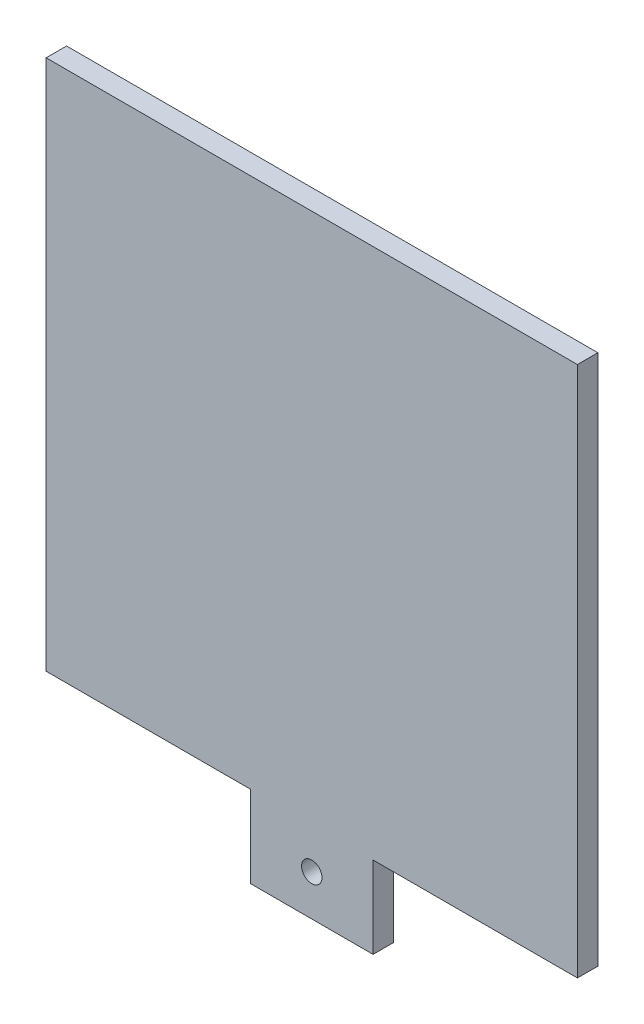
ISO-10303-21;
HEADER;
FILE_DESCRIPTION(('STEP AP214'),'2;1');
FILE_NAME('part.step','',(''),(''),'','','');
FILE_SCHEMA(('AUTOMOTIVE_DESIGN { 1 0 10303 214 1 1 1 1 }'));
ENDSEC;
DATA;
#1=APPLICATION_CONTEXT('core data for automotive mechanical design processes');
#2=APPLICATION_PROTOCOL_DEFINITION('international standard','automotive_design',2000,#1);
#3=PRODUCT_CONTEXT('',#1,'mechanical');
#4=PRODUCT('Part','Part','',(#3));
#5=PRODUCT_RELATED_PRODUCT_CATEGORY('part','',(#4));
#6=PRODUCT_DEFINITION_FORMATION('','',#4);
#7=PRODUCT_DEFINITION_CONTEXT('part definition',#1,'design');
#8=PRODUCT_DEFINITION('design','',#6,#7);
#9=PRODUCT_DEFINITION_SHAPE('','',#8);
#10=(LENGTH_UNIT() NAMED_UNIT(*) SI_UNIT(.MILLI.,.METRE.));
#11=(NAMED_UNIT(*) PLANE_ANGLE_UNIT() SI_UNIT($,.RADIAN.));
#12=(NAMED_UNIT(*) SI_UNIT($,.STERADIAN.) SOLID_ANGLE_UNIT());
#13=UNCERTAINTY_MEASURE_WITH_UNIT(LENGTH_MEASURE(1.E-05),#10,'distance_accuracy_value','');
#14=(GEOMETRIC_REPRESENTATION_CONTEXT(3) GLOBAL_UNCERTAINTY_ASSIGNED_CONTEXT((#13)) GLOBAL_UNIT_ASSIGNED_CONTEXT((#10,
#11,#12)) REPRESENTATION_CONTEXT('',''));
#15=CARTESIAN_POINT('',(0.,0.,0.));
#16=DIRECTION('',(0.,0.,1.));
#17=DIRECTION('',(1.,0.,0.));
#18=AXIS2_PLACEMENT_3D('',#15,#16,#17);
#19=CARTESIAN_POINT('',(15.,-65.,5.));
#20=DIRECTION('',(0.,1.,0.));
#21=DIRECTION('',(0.,0.,1.));
#22=AXIS2_PLACEMENT_3D('',#19,#20,#21);
#23=PLANE('',#22);
#24=DIRECTION('',(1.,0.,0.));
#25=VECTOR('',#24,1.);
#26=CARTESIAN_POINT('',(15.,-65.,0.));
#27=LINE('',#26,#25);
#28=CARTESIAN_POINT('',(15.,-65.,0.));
#29=VERTEX_POINT('',#28);
#30=CARTESIAN_POINT('',(65.,-65.,0.));
#31=VERTEX_POINT('',#30);
#32=EDGE_CURVE('E135',#29,#31,#27,.T.);
#33=ORIENTED_EDGE('',*,*,#32,.T.);
#34=DIRECTION('',(0.,0.,-1.));
#35=VECTOR('',#34,1.);
#36=CARTESIAN_POINT('',(65.,-65.,5.));
#37=LINE('',#36,#35);
#38=CARTESIAN_POINT('',(65.,-65.,5.));
#39=VERTEX_POINT('',#38);
#40=EDGE_CURVE('E11',#39,#31,#37,.T.);
#41=ORIENTED_EDGE('',*,*,#40,.F.);
#42=DIRECTION('',(1.,0.,0.));
#43=VECTOR('',#42,1.);
#44=CARTESIAN_POINT('',(15.,-65.,5.));
#45=LINE('',#44,#43);
#46=CARTESIAN_POINT('',(15.,-65.,5.));
#47=VERTEX_POINT('',#46);
#48=EDGE_CURVE('E150',#47,#39,#45,.T.);
#49=ORIENTED_EDGE('',*,*,#48,.F.);
#50=DIRECTION('',(0.,0.,-1.));
#51=VECTOR('',#50,1.);
#52=CARTESIAN_POINT('',(15.,-65.,5.));
#53=LINE('',#52,#51);
#54=EDGE_CURVE('E131',#47,#29,#53,.T.);
#55=ORIENTED_EDGE('',*,*,#54,.T.);
#56=EDGE_LOOP('',(#33,#41,#49,#55));
#57=FACE_BOUND('',#56,.T.);
#58=ADVANCED_FACE('F39',(#57),#23,.F.);
#59=CARTESIAN_POINT('',(65.,65.,5.));
#60=DIRECTION('',(-1.,0.,0.));
#61=DIRECTION('',(0.,-1.,0.));
#62=AXIS2_PLACEMENT_3D('',#59,#60,#61);
#63=PLANE('',#62);
#64=DIRECTION('',(0.,1.,0.));
#65=VECTOR('',#64,1.);
#66=CARTESIAN_POINT('',(65.,65.,0.));
#67=LINE('',#66,#65);
#68=CARTESIAN_POINT('',(65.,65.,0.));
#69=VERTEX_POINT('',#68);
#70=EDGE_CURVE('E138',#31,#69,#67,.T.);
#71=ORIENTED_EDGE('',*,*,#70,.T.);
#72=DIRECTION('',(0.,0.,-1.));
#73=VECTOR('',#72,1.);
#74=CARTESIAN_POINT('',(65.,65.,5.));
#75=LINE('',#74,#73);
#76=CARTESIAN_POINT('',(65.,65.,5.));
#77=VERTEX_POINT('',#76);
#78=EDGE_CURVE('E47',#77,#69,#75,.T.);
#79=ORIENTED_EDGE('',*,*,#78,.F.);
#80=DIRECTION('',(0.,1.,0.));
#81=VECTOR('',#80,1.);
#82=CARTESIAN_POINT('',(65.,65.,5.));
#83=LINE('',#82,#81);
#84=EDGE_CURVE('E98',#39,#77,#83,.T.);
#85=ORIENTED_EDGE('',*,*,#84,.F.);
#86=ORIENTED_EDGE('',*,*,#40,.T.);
#87=EDGE_LOOP('',(#71,#79,#85,#86));
#88=FACE_BOUND('',#87,.T.);
#89=ADVANCED_FACE('F205',(#88),#63,.F.);
#90=CARTESIAN_POINT('',(-65.,65.,5.));
#91=DIRECTION('',(0.,-1.,0.));
#92=DIRECTION('',(0.,0.,-1.));
#93=AXIS2_PLACEMENT_3D('',#90,#91,#92);
#94=PLANE('',#93);
#95=DIRECTION('',(-1.,0.,0.));
#96=VECTOR('',#95,1.);
#97=CARTESIAN_POINT('',(-65.,65.,0.));
#98=LINE('',#97,#96);
#99=CARTESIAN_POINT('',(-65.,65.,0.));
#100=VERTEX_POINT('',#99);
#101=EDGE_CURVE('E141',#69,#100,#98,.T.);
#102=ORIENTED_EDGE('',*,*,#101,.T.);
#103=DIRECTION('',(0.,0.,-1.));
#104=VECTOR('',#103,1.);
#105=CARTESIAN_POINT('',(-65.,65.,5.));
#106=LINE('',#105,#104);
#107=CARTESIAN_POINT('',(-65.,65.,5.));
#108=VERTEX_POINT('',#107);
#109=EDGE_CURVE('E157',#108,#100,#106,.T.);
#110=ORIENTED_EDGE('',*,*,#109,.F.);
#111=DIRECTION('',(-1.,0.,0.));
#112=VECTOR('',#111,1.);
#113=CARTESIAN_POINT('',(-65.,65.,5.));
#114=LINE('',#113,#112);
#115=EDGE_CURVE('E165',#77,#108,#114,.T.);
#116=ORIENTED_EDGE('',*,*,#115,.F.);
#117=ORIENTED_EDGE('',*,*,#78,.T.);
#118=EDGE_LOOP('',(#102,#110,#116,#117));
#119=FACE_BOUND('',#118,.T.);
#120=ADVANCED_FACE('F163',(#119),#94,.F.);
#121=CARTESIAN_POINT('',(-65.,65.,5.));
#122=DIRECTION('',(1.,0.,0.));
#123=DIRECTION('',(0.,1.,0.));
#124=AXIS2_PLACEMENT_3D('',#121,#122,#123);
#125=PLANE('',#124);
#126=DIRECTION('',(0.,-1.,0.));
#127=VECTOR('',#126,1.);
#128=CARTESIAN_POINT('',(-65.,65.,0.));
#129=LINE('',#128,#127);
#130=CARTESIAN_POINT('',(-65.,-65.,0.));
#131=VERTEX_POINT('',#130);
#132=EDGE_CURVE('E143',#100,#131,#129,.T.);
#133=ORIENTED_EDGE('',*,*,#132,.T.);
#134=DIRECTION('',(0.,0.,-1.));
#135=VECTOR('',#134,1.);
#136=CARTESIAN_POINT('',(-65.,-65.,5.));
#137=LINE('',#136,#135);
#138=CARTESIAN_POINT('',(-65.,-65.,5.));
#139=VERTEX_POINT('',#138);
#140=EDGE_CURVE('E154',#139,#131,#137,.T.);
#141=ORIENTED_EDGE('',*,*,#140,.F.);
#142=DIRECTION('',(0.,-1.,0.));
#143=VECTOR('',#142,1.);
#144=CARTESIAN_POINT('',(-65.,65.,5.));
#145=LINE('',#144,#143);
#146=EDGE_CURVE('E177',#108,#139,#145,.T.);
#147=ORIENTED_EDGE('',*,*,#146,.F.);
#148=ORIENTED_EDGE('',*,*,#109,.T.);
#149=EDGE_LOOP('',(#133,#141,#147,#148));
#150=FACE_BOUND('',#149,.T.);
#151=ADVANCED_FACE('F173',(#150),#125,.F.);
#152=CARTESIAN_POINT('',(-65.,-65.,5.));
#153=DIRECTION('',(0.,1.,0.));
#154=DIRECTION('',(0.,0.,1.));
#155=AXIS2_PLACEMENT_3D('',#152,#153,#154);
#156=PLANE('',#155);
#157=DIRECTION('',(1.,0.,0.));
#158=VECTOR('',#157,1.);
#159=CARTESIAN_POINT('',(-65.,-65.,0.));
#160=LINE('',#159,#158);
#161=CARTESIAN_POINT('',(-15.,-65.,0.));
#162=VERTEX_POINT('',#161);
#163=EDGE_CURVE('E145',#131,#162,#160,.T.);
#164=ORIENTED_EDGE('',*,*,#163,.T.);
#165=DIRECTION('',(0.,0.,-1.));
#166=VECTOR('',#165,1.);
#167=CARTESIAN_POINT('',(-15.,-65.,5.));
#168=LINE('',#167,#166);
#169=CARTESIAN_POINT('',(-15.,-65.,5.));
#170=VERTEX_POINT('',#169);
#171=EDGE_CURVE('E126',#170,#162,#168,.T.);
#172=ORIENTED_EDGE('',*,*,#171,.F.);
#173=DIRECTION('',(1.,0.,0.));
#174=VECTOR('',#173,1.);
#175=CARTESIAN_POINT('',(-65.,-65.,5.));
#176=LINE('',#175,#174);
#177=EDGE_CURVE('E117',#139,#170,#176,.T.);
#178=ORIENTED_EDGE('',*,*,#177,.F.);
#179=ORIENTED_EDGE('',*,*,#140,.T.);
#180=EDGE_LOOP('',(#164,#172,#178,#179));
#181=FACE_BOUND('',#180,.T.);
#182=ADVANCED_FACE('F176',(#181),#156,.F.);
#183=CARTESIAN_POINT('',(-15.,-85.,5.));
#184=DIRECTION('',(1.,0.,0.));
#185=DIRECTION('',(0.,0.,-1.));
#186=AXIS2_PLACEMENT_3D('',#183,#184,#185);
#187=PLANE('',#186);
#188=DIRECTION('',(0.,-1.,0.));
#189=VECTOR('',#188,1.);
#190=CARTESIAN_POINT('',(-15.,-85.,0.));
#191=LINE('',#190,#189);
#192=CARTESIAN_POINT('',(-15.,-85.,0.));
#193=VERTEX_POINT('',#192);
#194=EDGE_CURVE('E125',#162,#193,#191,.T.);
#195=ORIENTED_EDGE('',*,*,#194,.T.);
#196=DIRECTION('',(0.,0.,-1.));
#197=VECTOR('',#196,1.);
#198=CARTESIAN_POINT('',(-15.,-85.,5.));
#199=LINE('',#198,#197);
#200=CARTESIAN_POINT('',(-15.,-85.,5.));
#201=VERTEX_POINT('',#200);
#202=EDGE_CURVE('E122',#201,#193,#199,.T.);
#203=ORIENTED_EDGE('',*,*,#202,.F.);
#204=DIRECTION('',(0.,-1.,0.));
#205=VECTOR('',#204,1.);
#206=CARTESIAN_POINT('',(-15.,-85.,5.));
#207=LINE('',#206,#205);
#208=EDGE_CURVE('E111',#170,#201,#207,.T.);
#209=ORIENTED_EDGE('',*,*,#208,.F.);
#210=ORIENTED_EDGE('',*,*,#171,.T.);
#211=EDGE_LOOP('',(#195,#203,#209,#210));
#212=FACE_BOUND('',#211,.T.);
#213=ADVANCED_FACE('F123',(#212),#187,.F.);
#214=CARTESIAN_POINT('',(-15.,-85.,5.));
#215=DIRECTION('',(0.,1.,0.));
#216=DIRECTION('',(0.,0.,1.));
#217=AXIS2_PLACEMENT_3D('',#214,#215,#216);
#218=PLANE('',#217);
#219=DIRECTION('',(1.,0.,0.));
#220=VECTOR('',#219,1.);
#221=CARTESIAN_POINT('',(-15.,-85.,0.));
#222=LINE('',#221,#220);
#223=CARTESIAN_POINT('',(15.,-85.,0.));
#224=VERTEX_POINT('',#223);
#225=EDGE_CURVE('E84',#193,#224,#222,.T.);
#226=ORIENTED_EDGE('',*,*,#225,.T.);
#227=DIRECTION('',(0.,0.,-1.));
#228=VECTOR('',#227,1.);
#229=CARTESIAN_POINT('',(15.,-85.,5.));
#230=LINE('',#229,#228);
#231=CARTESIAN_POINT('',(15.,-85.,5.));
#232=VERTEX_POINT('',#231);
#233=EDGE_CURVE('E127',#232,#224,#230,.T.);
#234=ORIENTED_EDGE('',*,*,#233,.F.);
#235=DIRECTION('',(1.,0.,0.));
#236=VECTOR('',#235,1.);
#237=CARTESIAN_POINT('',(-15.,-85.,5.));
#238=LINE('',#237,#236);
#239=EDGE_CURVE('E115',#201,#232,#238,.T.);
#240=ORIENTED_EDGE('',*,*,#239,.F.);
#241=ORIENTED_EDGE('',*,*,#202,.T.);
#242=EDGE_LOOP('',(#226,#234,#240,#241));
#243=FACE_BOUND('',#242,.T.);
#244=ADVANCED_FACE('F129',(#243),#218,.F.);
#245=CARTESIAN_POINT('',(15.,-85.,5.));
#246=DIRECTION('',(-1.,0.,0.));
#247=DIRECTION('',(0.,0.,1.));
#248=AXIS2_PLACEMENT_3D('',#245,#246,#247);
#249=PLANE('',#248);
#250=DIRECTION('',(0.,1.,0.));
#251=VECTOR('',#250,1.);
#252=CARTESIAN_POINT('',(15.,-85.,0.));
#253=LINE('',#252,#251);
#254=EDGE_CURVE('E90',#224,#29,#253,.T.);
#255=ORIENTED_EDGE('',*,*,#254,.T.);
#256=ORIENTED_EDGE('',*,*,#54,.F.);
#257=DIRECTION('',(0.,1.,0.));
#258=VECTOR('',#257,1.);
#259=CARTESIAN_POINT('',(15.,-85.,5.));
#260=LINE('',#259,#258);
#261=EDGE_CURVE('E55',#232,#47,#260,.T.);
#262=ORIENTED_EDGE('',*,*,#261,.F.);
#263=ORIENTED_EDGE('',*,*,#233,.T.);
#264=EDGE_LOOP('',(#255,#256,#262,#263));
#265=FACE_BOUND('',#264,.T.);
#266=ADVANCED_FACE('F201',(#265),#249,.F.);
#267=CARTESIAN_POINT('',(0.,0.,5.));
#268=DIRECTION('',(0.,0.,-1.));
#269=DIRECTION('',(-1.,0.,0.));
#270=AXIS2_PLACEMENT_3D('',#267,#268,#269);
#271=PLANE('',#270);
#272=CARTESIAN_POINT('',(0.,-75.,5.));
#273=DIRECTION('',(0.,0.,-1.));
#274=DIRECTION('',(-1.,0.,0.));
#275=AXIS2_PLACEMENT_3D('',#272,#273,#274);
#276=CIRCLE('',#275,2.5);
#277=CARTESIAN_POINT('',(-2.5,-75.,5.));
#278=VERTEX_POINT('',#277);
#279=EDGE_CURVE('E139',#278,#278,#276,.T.);
#280=ORIENTED_EDGE('',*,*,#279,.T.);
#281=EDGE_LOOP('',(#280));
#282=FACE_BOUND('',#281,.T.);
#283=ORIENTED_EDGE('',*,*,#48,.T.);
#284=ORIENTED_EDGE('',*,*,#84,.T.);
#285=ORIENTED_EDGE('',*,*,#115,.T.);
#286=ORIENTED_EDGE('',*,*,#146,.T.);
#287=ORIENTED_EDGE('',*,*,#177,.T.);
#288=ORIENTED_EDGE('',*,*,#208,.T.);
#289=ORIENTED_EDGE('',*,*,#239,.T.);
#290=ORIENTED_EDGE('',*,*,#261,.T.);
#291=EDGE_LOOP('',(#283,#284,#285,#286,#287,#288,#289,#290));
#292=FACE_BOUND('',#291,.T.);
#293=ADVANCED_FACE('F113',(#282,#292),#271,.F.);
#294=CARTESIAN_POINT('',(0.,0.,0.));
#295=DIRECTION('',(0.,0.,-1.));
#296=DIRECTION('',(-1.,0.,0.));
#297=AXIS2_PLACEMENT_3D('',#294,#295,#296);
#298=PLANE('',#297);
#299=CARTESIAN_POINT('',(0.,-75.,0.));
#300=DIRECTION('',(0.,0.,-1.));
#301=DIRECTION('',(-1.,0.,0.));
#302=AXIS2_PLACEMENT_3D('',#299,#300,#301);
#303=CIRCLE('',#302,2.5);
#304=CARTESIAN_POINT('',(-2.5,-75.,0.));
#305=VERTEX_POINT('',#304);
#306=EDGE_CURVE('E183',#305,#305,#303,.T.);
#307=ORIENTED_EDGE('',*,*,#306,.F.);
#308=EDGE_LOOP('',(#307));
#309=FACE_BOUND('',#308,.T.);
#310=ORIENTED_EDGE('',*,*,#32,.F.);
#311=ORIENTED_EDGE('',*,*,#254,.F.);
#312=ORIENTED_EDGE('',*,*,#225,.F.);
#313=ORIENTED_EDGE('',*,*,#194,.F.);
#314=ORIENTED_EDGE('',*,*,#163,.F.);
#315=ORIENTED_EDGE('',*,*,#132,.F.);
#316=ORIENTED_EDGE('',*,*,#101,.F.);
#317=ORIENTED_EDGE('',*,*,#70,.F.);
#318=EDGE_LOOP('',(#310,#311,#312,#313,#314,#315,#316,#317));
#319=FACE_BOUND('',#318,.T.);
#320=ADVANCED_FACE('F169',(#309,#319),#298,.T.);
#321=CARTESIAN_POINT('',(0.,-75.,5.));
#322=DIRECTION('',(0.,0.,-1.));
#323=DIRECTION('',(-1.,0.,0.));
#324=AXIS2_PLACEMENT_3D('',#321,#322,#323);
#325=CYLINDRICAL_SURFACE('',#324,2.5);
#326=ORIENTED_EDGE('',*,*,#279,.F.);
#327=EDGE_LOOP('',(#326));
#328=FACE_BOUND('',#327,.T.);
#329=ORIENTED_EDGE('',*,*,#306,.T.);
#330=EDGE_LOOP('',(#329));
#331=FACE_BOUND('',#330,.T.);
#332=ADVANCED_FACE('F190',(#328,#331),#325,.F.);
#333=CLOSED_SHELL('',(#58,#89,#120,#151,#182,#213,#244,#266,#293,#320,#332));
#334=MANIFOLD_SOLID_BREP('B2',#333);
#335=ADVANCED_BREP_SHAPE_REPRESENTATION('',(#18,#334),#14);
#336=SHAPE_DEFINITION_REPRESENTATION(#9,#335);
ENDSEC;
END-ISO-10303-21;
